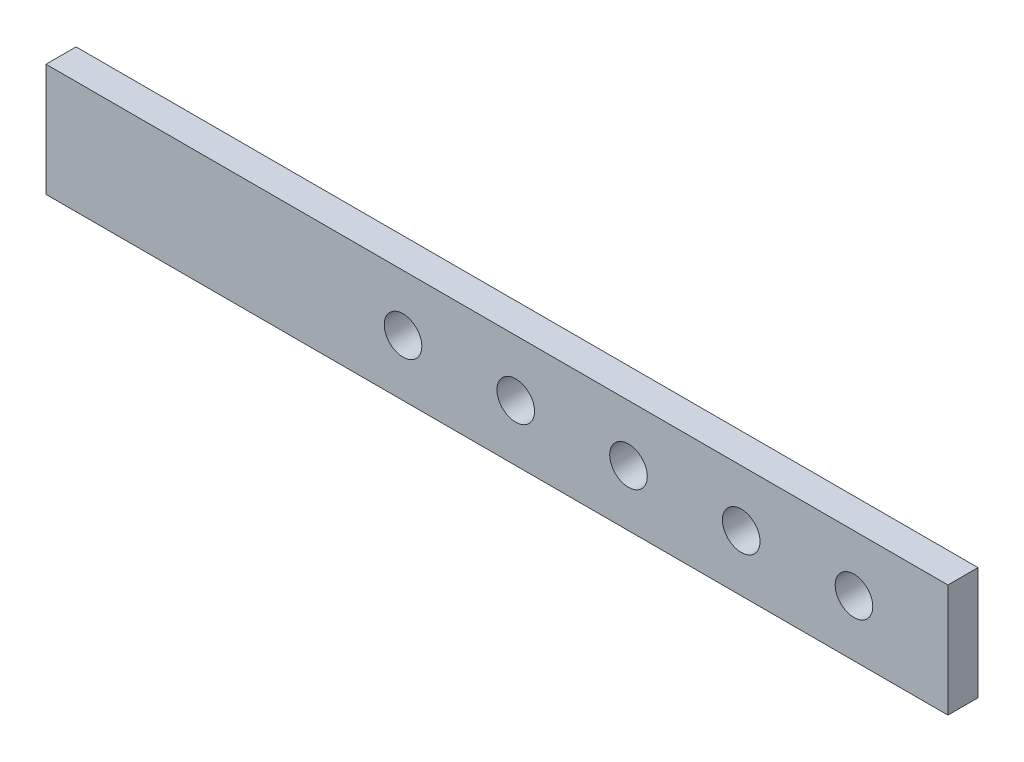
ISO-10303-21;
HEADER;
FILE_DESCRIPTION(('STEP AP214'),'2;1');
FILE_NAME('part.step','',(''),(''),'','','');
FILE_SCHEMA(('AUTOMOTIVE_DESIGN { 1 0 10303 214 1 1 1 1 }'));
ENDSEC;
DATA;
#1=APPLICATION_CONTEXT('core data for automotive mechanical design processes');
#2=APPLICATION_PROTOCOL_DEFINITION('international standard','automotive_design',2000,#1);
#3=PRODUCT_CONTEXT('',#1,'mechanical');
#4=PRODUCT('Part','Part','',(#3));
#5=PRODUCT_RELATED_PRODUCT_CATEGORY('part','',(#4));
#6=PRODUCT_DEFINITION_FORMATION('','',#4);
#7=PRODUCT_DEFINITION_CONTEXT('part definition',#1,'design');
#8=PRODUCT_DEFINITION('design','',#6,#7);
#9=PRODUCT_DEFINITION_SHAPE('','',#8);
#10=(LENGTH_UNIT() NAMED_UNIT(*) SI_UNIT(.MILLI.,.METRE.));
#11=(NAMED_UNIT(*) PLANE_ANGLE_UNIT() SI_UNIT($,.RADIAN.));
#12=(NAMED_UNIT(*) SI_UNIT($,.STERADIAN.) SOLID_ANGLE_UNIT());
#13=UNCERTAINTY_MEASURE_WITH_UNIT(LENGTH_MEASURE(1.E-05),#10,'distance_accuracy_value','');
#14=(GEOMETRIC_REPRESENTATION_CONTEXT(3) GLOBAL_UNCERTAINTY_ASSIGNED_CONTEXT((#13)) GLOBAL_UNIT_ASSIGNED_CONTEXT((#10,
#11,#12)) REPRESENTATION_CONTEXT('',''));
#15=CARTESIAN_POINT('',(0.,0.,0.));
#16=DIRECTION('',(0.,0.,1.));
#17=DIRECTION('',(1.,0.,0.));
#18=AXIS2_PLACEMENT_3D('',#15,#16,#17);
#19=CARTESIAN_POINT('',(0.,0.,10.16));
#20=DIRECTION('',(0.,0.,1.));
#21=DIRECTION('',(1.,0.,0.));
#22=AXIS2_PLACEMENT_3D('',#19,#20,#21);
#23=PLANE('',#22);
#24=CARTESIAN_POINT('',(-15.8989441931469,37.1717157555876,10.16));
#25=DIRECTION('',(0.,0.,1.));
#26=DIRECTION('',(1.,0.,0.));
#27=AXIS2_PLACEMENT_3D('',#24,#25,#26);
#28=CIRCLE('',#27,6.35);
#29=CARTESIAN_POINT('',(-9.54894419314691,37.1717157555876,10.16));
#30=VERTEX_POINT('',#29);
#31=EDGE_CURVE('E127',#30,#30,#28,.T.);
#32=ORIENTED_EDGE('',*,*,#31,.F.);
#33=EDGE_LOOP('',(#32));
#34=FACE_BOUND('',#33,.T.);
#35=CARTESIAN_POINT('',(60.3010558068531,37.1717157555876,10.16));
#36=DIRECTION('',(0.,0.,1.));
#37=DIRECTION('',(1.,0.,0.));
#38=AXIS2_PLACEMENT_3D('',#35,#36,#37);
#39=CIRCLE('',#38,6.35);
#40=CARTESIAN_POINT('',(66.6510558068531,37.1717157555876,10.16));
#41=VERTEX_POINT('',#40);
#42=EDGE_CURVE('E115',#41,#41,#39,.T.);
#43=ORIENTED_EDGE('',*,*,#42,.F.);
#44=EDGE_LOOP('',(#43));
#45=FACE_BOUND('',#44,.T.);
#46=DIRECTION('',(0.,-1.,0.));
#47=VECTOR('',#46,1.);
#48=CARTESIAN_POINT('',(-174.648944193147,56.2217157555876,10.16));
#49=LINE('',#48,#47);
#50=CARTESIAN_POINT('',(-174.648944193147,56.2217157555876,10.16));
#51=VERTEX_POINT('',#50);
#52=CARTESIAN_POINT('',(-174.648944193147,18.1217157555876,10.16));
#53=VERTEX_POINT('',#52);
#54=EDGE_CURVE('E85',#51,#53,#49,.T.);
#55=ORIENTED_EDGE('',*,*,#54,.T.);
#56=DIRECTION('',(1.,0.,0.));
#57=VECTOR('',#56,1.);
#58=CARTESIAN_POINT('',(-174.648944193147,18.1217157555876,10.16));
#59=LINE('',#58,#57);
#60=CARTESIAN_POINT('',(130.151055806853,18.1217157555876,10.16));
#61=VERTEX_POINT('',#60);
#62=EDGE_CURVE('E80',#53,#61,#59,.T.);
#63=ORIENTED_EDGE('',*,*,#62,.T.);
#64=DIRECTION('',(0.,1.,0.));
#65=VECTOR('',#64,1.);
#66=CARTESIAN_POINT('',(130.151055806853,56.2217157555876,10.16));
#67=LINE('',#66,#65);
#68=CARTESIAN_POINT('',(130.151055806853,56.2217157555876,10.16));
#69=VERTEX_POINT('',#68);
#70=EDGE_CURVE('E83',#61,#69,#67,.T.);
#71=ORIENTED_EDGE('',*,*,#70,.T.);
#72=DIRECTION('',(-1.,0.,0.));
#73=VECTOR('',#72,1.);
#74=CARTESIAN_POINT('',(-174.648944193147,56.2217157555876,10.16));
#75=LINE('',#74,#73);
#76=EDGE_CURVE('E50',#69,#51,#75,.T.);
#77=ORIENTED_EDGE('',*,*,#76,.T.);
#78=EDGE_LOOP('',(#55,#63,#71,#77));
#79=FACE_BOUND('',#78,.T.);
#80=CARTESIAN_POINT('',(98.4010558068531,37.1717157555876,10.16));
#81=DIRECTION('',(0.,0.,1.));
#82=DIRECTION('',(1.,0.,0.));
#83=AXIS2_PLACEMENT_3D('',#80,#81,#82);
#84=CIRCLE('',#83,6.35);
#85=CARTESIAN_POINT('',(104.751055806853,37.1717157555876,10.16));
#86=VERTEX_POINT('',#85);
#87=EDGE_CURVE('E100',#86,#86,#84,.T.);
#88=ORIENTED_EDGE('',*,*,#87,.F.);
#89=EDGE_LOOP('',(#88));
#90=FACE_BOUND('',#89,.T.);
#91=CARTESIAN_POINT('',(22.2010558068531,37.1717157555876,10.16));
#92=DIRECTION('',(0.,0.,1.));
#93=DIRECTION('',(1.,0.,0.));
#94=AXIS2_PLACEMENT_3D('',#91,#92,#93);
#95=CIRCLE('',#94,6.35);
#96=CARTESIAN_POINT('',(28.5510558068531,37.1717157555876,10.16));
#97=VERTEX_POINT('',#96);
#98=EDGE_CURVE('E121',#97,#97,#95,.T.);
#99=ORIENTED_EDGE('',*,*,#98,.F.);
#100=EDGE_LOOP('',(#99));
#101=FACE_BOUND('',#100,.T.);
#102=CARTESIAN_POINT('',(-53.9989441931469,37.1717157555876,10.16));
#103=DIRECTION('',(0.,0.,1.));
#104=DIRECTION('',(1.,0.,0.));
#105=AXIS2_PLACEMENT_3D('',#102,#103,#104);
#106=CIRCLE('',#105,6.35);
#107=CARTESIAN_POINT('',(-47.6489441931469,37.1717157555876,10.16));
#108=VERTEX_POINT('',#107);
#109=EDGE_CURVE('E133',#108,#108,#106,.T.);
#110=ORIENTED_EDGE('',*,*,#109,.F.);
#111=EDGE_LOOP('',(#110));
#112=FACE_BOUND('',#111,.T.);
#113=ADVANCED_FACE('F33',(#34,#45,#79,#90,#101,#112),#23,.T.);
#114=CARTESIAN_POINT('',(0.,0.,0.));
#115=DIRECTION('',(0.,0.,1.));
#116=DIRECTION('',(1.,0.,0.));
#117=AXIS2_PLACEMENT_3D('',#114,#115,#116);
#118=PLANE('',#117);
#119=DIRECTION('',(0.,-1.,0.));
#120=VECTOR('',#119,1.);
#121=CARTESIAN_POINT('',(-174.648944193147,56.2217157555876,0.));
#122=LINE('',#121,#120);
#123=CARTESIAN_POINT('',(-174.648944193147,56.2217157555876,0.));
#124=VERTEX_POINT('',#123);
#125=CARTESIAN_POINT('',(-174.648944193147,18.1217157555876,0.));
#126=VERTEX_POINT('',#125);
#127=EDGE_CURVE('E97',#124,#126,#122,.T.);
#128=ORIENTED_EDGE('',*,*,#127,.F.);
#129=DIRECTION('',(-1.,0.,0.));
#130=VECTOR('',#129,1.);
#131=CARTESIAN_POINT('',(-174.648944193147,56.2217157555876,0.));
#132=LINE('',#131,#130);
#133=CARTESIAN_POINT('',(130.151055806853,56.2217157555876,0.));
#134=VERTEX_POINT('',#133);
#135=EDGE_CURVE('E73',#134,#124,#132,.T.);
#136=ORIENTED_EDGE('',*,*,#135,.F.);
#137=DIRECTION('',(0.,1.,0.));
#138=VECTOR('',#137,1.);
#139=CARTESIAN_POINT('',(130.151055806853,56.2217157555876,0.));
#140=LINE('',#139,#138);
#141=CARTESIAN_POINT('',(130.151055806853,18.1217157555876,0.));
#142=VERTEX_POINT('',#141);
#143=EDGE_CURVE('E67',#142,#134,#140,.T.);
#144=ORIENTED_EDGE('',*,*,#143,.F.);
#145=DIRECTION('',(1.,0.,0.));
#146=VECTOR('',#145,1.);
#147=CARTESIAN_POINT('',(-174.648944193147,18.1217157555876,0.));
#148=LINE('',#147,#146);
#149=EDGE_CURVE('E89',#126,#142,#148,.T.);
#150=ORIENTED_EDGE('',*,*,#149,.F.);
#151=EDGE_LOOP('',(#128,#136,#144,#150));
#152=FACE_BOUND('',#151,.T.);
#153=CARTESIAN_POINT('',(98.4010558068531,37.1717157555876,0.));
#154=DIRECTION('',(0.,0.,1.));
#155=DIRECTION('',(1.,0.,0.));
#156=AXIS2_PLACEMENT_3D('',#153,#154,#155);
#157=CIRCLE('',#156,6.35);
#158=CARTESIAN_POINT('',(104.751055806853,37.1717157555876,0.));
#159=VERTEX_POINT('',#158);
#160=EDGE_CURVE('E112',#159,#159,#157,.T.);
#161=ORIENTED_EDGE('',*,*,#160,.T.);
#162=EDGE_LOOP('',(#161));
#163=FACE_BOUND('',#162,.T.);
#164=CARTESIAN_POINT('',(60.3010558068531,37.1717157555876,0.));
#165=DIRECTION('',(0.,0.,1.));
#166=DIRECTION('',(1.,0.,0.));
#167=AXIS2_PLACEMENT_3D('',#164,#165,#166);
#168=CIRCLE('',#167,6.35);
#169=CARTESIAN_POINT('',(66.6510558068531,37.1717157555876,0.));
#170=VERTEX_POINT('',#169);
#171=EDGE_CURVE('E118',#170,#170,#168,.T.);
#172=ORIENTED_EDGE('',*,*,#171,.T.);
#173=EDGE_LOOP('',(#172));
#174=FACE_BOUND('',#173,.T.);
#175=CARTESIAN_POINT('',(22.2010558068531,37.1717157555876,0.));
#176=DIRECTION('',(0.,0.,1.));
#177=DIRECTION('',(1.,0.,0.));
#178=AXIS2_PLACEMENT_3D('',#175,#176,#177);
#179=CIRCLE('',#178,6.35);
#180=CARTESIAN_POINT('',(28.5510558068531,37.1717157555876,0.));
#181=VERTEX_POINT('',#180);
#182=EDGE_CURVE('E124',#181,#181,#179,.T.);
#183=ORIENTED_EDGE('',*,*,#182,.T.);
#184=EDGE_LOOP('',(#183));
#185=FACE_BOUND('',#184,.T.);
#186=CARTESIAN_POINT('',(-15.8989441931469,37.1717157555876,0.));
#187=DIRECTION('',(0.,0.,1.));
#188=DIRECTION('',(1.,0.,0.));
#189=AXIS2_PLACEMENT_3D('',#186,#187,#188);
#190=CIRCLE('',#189,6.35);
#191=CARTESIAN_POINT('',(-9.54894419314691,37.1717157555876,0.));
#192=VERTEX_POINT('',#191);
#193=EDGE_CURVE('E130',#192,#192,#190,.T.);
#194=ORIENTED_EDGE('',*,*,#193,.T.);
#195=EDGE_LOOP('',(#194));
#196=FACE_BOUND('',#195,.T.);
#197=CARTESIAN_POINT('',(-53.9989441931469,37.1717157555876,0.));
#198=DIRECTION('',(0.,0.,1.));
#199=DIRECTION('',(1.,0.,0.));
#200=AXIS2_PLACEMENT_3D('',#197,#198,#199);
#201=CIRCLE('',#200,6.35);
#202=CARTESIAN_POINT('',(-47.6489441931469,37.1717157555876,0.));
#203=VERTEX_POINT('',#202);
#204=EDGE_CURVE('E136',#203,#203,#201,.T.);
#205=ORIENTED_EDGE('',*,*,#204,.T.);
#206=EDGE_LOOP('',(#205));
#207=FACE_BOUND('',#206,.T.);
#208=ADVANCED_FACE('F108',(#152,#163,#174,#185,#196,#207),#118,.F.);
#209=CARTESIAN_POINT('',(-174.648944193147,56.2217157555876,10.16));
#210=DIRECTION('',(1.,0.,0.));
#211=DIRECTION('',(0.,0.,-1.));
#212=AXIS2_PLACEMENT_3D('',#209,#210,#211);
#213=PLANE('',#212);
#214=ORIENTED_EDGE('',*,*,#127,.T.);
#215=DIRECTION('',(0.,0.,-1.));
#216=VECTOR('',#215,1.);
#217=CARTESIAN_POINT('',(-174.648944193147,18.1217157555876,10.16));
#218=LINE('',#217,#216);
#219=EDGE_CURVE('E11',#53,#126,#218,.T.);
#220=ORIENTED_EDGE('',*,*,#219,.F.);
#221=ORIENTED_EDGE('',*,*,#54,.F.);
#222=DIRECTION('',(0.,0.,-1.));
#223=VECTOR('',#222,1.);
#224=CARTESIAN_POINT('',(-174.648944193147,56.2217157555876,10.16));
#225=LINE('',#224,#223);
#226=EDGE_CURVE('E93',#51,#124,#225,.T.);
#227=ORIENTED_EDGE('',*,*,#226,.T.);
#228=EDGE_LOOP('',(#214,#220,#221,#227));
#229=FACE_BOUND('',#228,.T.);
#230=ADVANCED_FACE('F35',(#229),#213,.F.);
#231=CARTESIAN_POINT('',(-174.648944193147,18.1217157555876,10.16));
#232=DIRECTION('',(0.,1.,0.));
#233=DIRECTION('',(0.,0.,1.));
#234=AXIS2_PLACEMENT_3D('',#231,#232,#233);
#235=PLANE('',#234);
#236=ORIENTED_EDGE('',*,*,#149,.T.);
#237=DIRECTION('',(0.,0.,-1.));
#238=VECTOR('',#237,1.);
#239=CARTESIAN_POINT('',(130.151055806853,18.1217157555876,10.16));
#240=LINE('',#239,#238);
#241=EDGE_CURVE('E42',#61,#142,#240,.T.);
#242=ORIENTED_EDGE('',*,*,#241,.F.);
#243=ORIENTED_EDGE('',*,*,#62,.F.);
#244=ORIENTED_EDGE('',*,*,#219,.T.);
#245=EDGE_LOOP('',(#236,#242,#243,#244));
#246=FACE_BOUND('',#245,.T.);
#247=ADVANCED_FACE('F88',(#246),#235,.F.);
#248=CARTESIAN_POINT('',(130.151055806853,56.2217157555876,10.16));
#249=DIRECTION('',(-1.,0.,0.));
#250=DIRECTION('',(0.,-1.,0.));
#251=AXIS2_PLACEMENT_3D('',#248,#249,#250);
#252=PLANE('',#251);
#253=ORIENTED_EDGE('',*,*,#143,.T.);
#254=DIRECTION('',(0.,0.,-1.));
#255=VECTOR('',#254,1.);
#256=CARTESIAN_POINT('',(130.151055806853,56.2217157555876,10.16));
#257=LINE('',#256,#255);
#258=EDGE_CURVE('E90',#69,#134,#257,.T.);
#259=ORIENTED_EDGE('',*,*,#258,.F.);
#260=ORIENTED_EDGE('',*,*,#70,.F.);
#261=ORIENTED_EDGE('',*,*,#241,.T.);
#262=EDGE_LOOP('',(#253,#259,#260,#261));
#263=FACE_BOUND('',#262,.T.);
#264=ADVANCED_FACE('F91',(#263),#252,.F.);
#265=CARTESIAN_POINT('',(-174.648944193147,56.2217157555876,10.16));
#266=DIRECTION('',(0.,-1.,0.));
#267=DIRECTION('',(0.,0.,-1.));
#268=AXIS2_PLACEMENT_3D('',#265,#266,#267);
#269=PLANE('',#268);
#270=ORIENTED_EDGE('',*,*,#135,.T.);
#271=ORIENTED_EDGE('',*,*,#226,.F.);
#272=ORIENTED_EDGE('',*,*,#76,.F.);
#273=ORIENTED_EDGE('',*,*,#258,.T.);
#274=EDGE_LOOP('',(#270,#271,#272,#273));
#275=FACE_BOUND('',#274,.T.);
#276=ADVANCED_FACE('F105',(#275),#269,.F.);
#277=CARTESIAN_POINT('',(98.4010558068531,37.1717157555876,10.16));
#278=DIRECTION('',(0.,0.,-1.));
#279=DIRECTION('',(-1.,0.,0.));
#280=AXIS2_PLACEMENT_3D('',#277,#278,#279);
#281=CYLINDRICAL_SURFACE('',#280,6.35);
#282=ORIENTED_EDGE('',*,*,#87,.T.);
#283=EDGE_LOOP('',(#282));
#284=FACE_BOUND('',#283,.T.);
#285=ORIENTED_EDGE('',*,*,#160,.F.);
#286=EDGE_LOOP('',(#285));
#287=FACE_BOUND('',#286,.T.);
#288=ADVANCED_FACE('F155',(#284,#287),#281,.F.);
#289=CARTESIAN_POINT('',(60.3010558068531,37.1717157555876,10.16));
#290=DIRECTION('',(0.,0.,-1.));
#291=DIRECTION('',(-1.,0.,0.));
#292=AXIS2_PLACEMENT_3D('',#289,#290,#291);
#293=CYLINDRICAL_SURFACE('',#292,6.35);
#294=ORIENTED_EDGE('',*,*,#42,.T.);
#295=EDGE_LOOP('',(#294));
#296=FACE_BOUND('',#295,.T.);
#297=ORIENTED_EDGE('',*,*,#171,.F.);
#298=EDGE_LOOP('',(#297));
#299=FACE_BOUND('',#298,.T.);
#300=ADVANCED_FACE('F201',(#296,#299),#293,.F.);
#301=CARTESIAN_POINT('',(22.2010558068531,37.1717157555876,10.16));
#302=DIRECTION('',(0.,0.,-1.));
#303=DIRECTION('',(-1.,0.,0.));
#304=AXIS2_PLACEMENT_3D('',#301,#302,#303);
#305=CYLINDRICAL_SURFACE('',#304,6.35);
#306=ORIENTED_EDGE('',*,*,#98,.T.);
#307=EDGE_LOOP('',(#306));
#308=FACE_BOUND('',#307,.T.);
#309=ORIENTED_EDGE('',*,*,#182,.F.);
#310=EDGE_LOOP('',(#309));
#311=FACE_BOUND('',#310,.T.);
#312=ADVANCED_FACE('F209',(#308,#311),#305,.F.);
#313=CARTESIAN_POINT('',(-15.8989441931469,37.1717157555876,10.16));
#314=DIRECTION('',(0.,0.,-1.));
#315=DIRECTION('',(-1.,0.,0.));
#316=AXIS2_PLACEMENT_3D('',#313,#314,#315);
#317=CYLINDRICAL_SURFACE('',#316,6.35);
#318=ORIENTED_EDGE('',*,*,#31,.T.);
#319=EDGE_LOOP('',(#318));
#320=FACE_BOUND('',#319,.T.);
#321=ORIENTED_EDGE('',*,*,#193,.F.);
#322=EDGE_LOOP('',(#321));
#323=FACE_BOUND('',#322,.T.);
#324=ADVANCED_FACE('F217',(#320,#323),#317,.F.);
#325=CARTESIAN_POINT('',(-53.9989441931469,37.1717157555876,10.16));
#326=DIRECTION('',(0.,0.,-1.));
#327=DIRECTION('',(-1.,0.,0.));
#328=AXIS2_PLACEMENT_3D('',#325,#326,#327);
#329=CYLINDRICAL_SURFACE('',#328,6.35);
#330=ORIENTED_EDGE('',*,*,#109,.T.);
#331=EDGE_LOOP('',(#330));
#332=FACE_BOUND('',#331,.T.);
#333=ORIENTED_EDGE('',*,*,#204,.F.);
#334=EDGE_LOOP('',(#333));
#335=FACE_BOUND('',#334,.T.);
#336=ADVANCED_FACE('F142',(#332,#335),#329,.F.);
#337=CLOSED_SHELL('',(#113,#208,#230,#247,#264,#276,#288,#300,#312,#324,#336));
#338=MANIFOLD_SOLID_BREP('B2',#337);
#339=ADVANCED_BREP_SHAPE_REPRESENTATION('',(#18,#338),#14);
#340=SHAPE_DEFINITION_REPRESENTATION(#9,#339);
ENDSEC;
END-ISO-10303-21;
